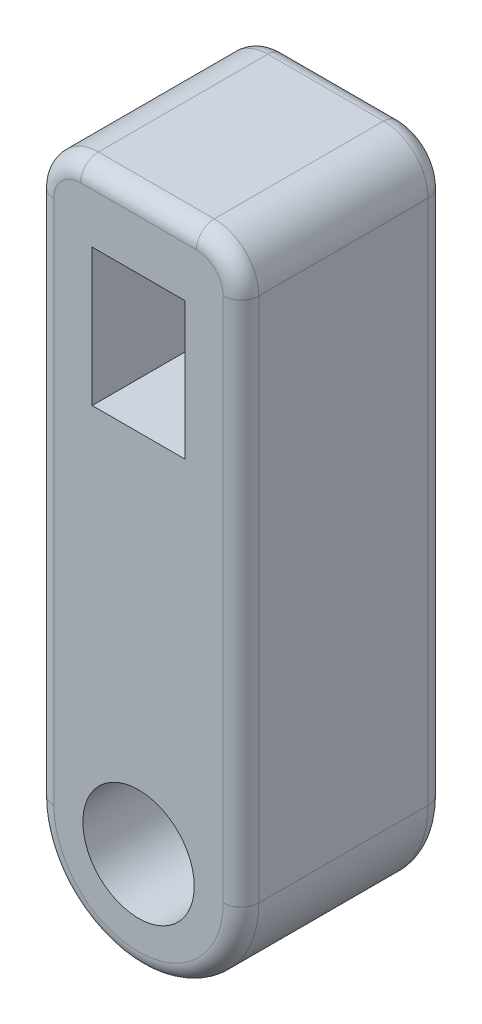
ISO-10303-21;
HEADER;
FILE_DESCRIPTION(('STEP AP214'),'2;1');
FILE_NAME('part.step','',(''),(''),'','','');
FILE_SCHEMA(('AUTOMOTIVE_DESIGN { 1 0 10303 214 1 1 1 1 }'));
ENDSEC;
DATA;
#1=APPLICATION_CONTEXT('core data for automotive mechanical design processes');
#2=APPLICATION_PROTOCOL_DEFINITION('international standard','automotive_design',2000,#1);
#3=PRODUCT_CONTEXT('',#1,'mechanical');
#4=PRODUCT('Part','Part','',(#3));
#5=PRODUCT_RELATED_PRODUCT_CATEGORY('part','',(#4));
#6=PRODUCT_DEFINITION_FORMATION('','',#4);
#7=PRODUCT_DEFINITION_CONTEXT('part definition',#1,'design');
#8=PRODUCT_DEFINITION('design','',#6,#7);
#9=PRODUCT_DEFINITION_SHAPE('','',#8);
#10=(LENGTH_UNIT() NAMED_UNIT(*) SI_UNIT(.MILLI.,.METRE.));
#11=(NAMED_UNIT(*) PLANE_ANGLE_UNIT() SI_UNIT($,.RADIAN.));
#12=(NAMED_UNIT(*) SI_UNIT($,.STERADIAN.) SOLID_ANGLE_UNIT());
#13=UNCERTAINTY_MEASURE_WITH_UNIT(LENGTH_MEASURE(1.E-05),#10,'distance_accuracy_value','');
#14=(GEOMETRIC_REPRESENTATION_CONTEXT(3) GLOBAL_UNCERTAINTY_ASSIGNED_CONTEXT((#13)) GLOBAL_UNIT_ASSIGNED_CONTEXT((#10,
#11,#12)) REPRESENTATION_CONTEXT('',''));
#15=CARTESIAN_POINT('',(0.,0.,0.));
#16=DIRECTION('',(0.,0.,1.));
#17=DIRECTION('',(1.,0.,0.));
#18=AXIS2_PLACEMENT_3D('',#15,#16,#17);
#19=CARTESIAN_POINT('',(5.2,0.,23.));
#20=DIRECTION('',(-1.,0.,0.));
#21=DIRECTION('',(0.,0.,1.));
#22=AXIS2_PLACEMENT_3D('',#19,#20,#21);
#23=PLANE('',#22);
#24=DIRECTION('',(0.,0.,-1.));
#25=VECTOR('',#24,1.);
#26=CARTESIAN_POINT('',(5.2,56.4,23.));
#27=LINE('',#26,#25);
#28=CARTESIAN_POINT('',(5.2,56.4,23.));
#29=VERTEX_POINT('',#28);
#30=CARTESIAN_POINT('',(5.2,56.4,2.74747741945462));
#31=VERTEX_POINT('',#30);
#32=EDGE_CURVE('E216',#29,#31,#27,.T.);
#33=ORIENTED_EDGE('',*,*,#32,.T.);
#34=DIRECTION('',(0.,-1.,0.));
#35=VECTOR('',#34,1.);
#36=CARTESIAN_POINT('',(5.2,41.,2.74747741945462));
#37=LINE('',#36,#35);
#38=CARTESIAN_POINT('',(5.2,41.,2.74747741945462));
#39=VERTEX_POINT('',#38);
#40=EDGE_CURVE('E178',#31,#39,#37,.T.);
#41=ORIENTED_EDGE('',*,*,#40,.T.);
#42=DIRECTION('',(0.,0.,-1.));
#43=VECTOR('',#42,1.);
#44=CARTESIAN_POINT('',(5.2,41.,23.));
#45=LINE('',#44,#43);
#46=CARTESIAN_POINT('',(5.2,41.,23.));
#47=VERTEX_POINT('',#46);
#48=EDGE_CURVE('E173',#47,#39,#45,.T.);
#49=ORIENTED_EDGE('',*,*,#48,.F.);
#50=DIRECTION('',(0.,1.,0.));
#51=VECTOR('',#50,1.);
#52=CARTESIAN_POINT('',(5.2,0.,23.));
#53=LINE('',#52,#51);
#54=EDGE_CURVE('E176',#47,#29,#53,.T.);
#55=ORIENTED_EDGE('',*,*,#54,.T.);
#56=EDGE_LOOP('',(#33,#41,#49,#55));
#57=FACE_BOUND('',#56,.T.);
#58=ADVANCED_FACE('F43',(#57),#23,.T.);
#59=CARTESIAN_POINT('',(0.,41.,23.));
#60=DIRECTION('',(0.,1.,0.));
#61=DIRECTION('',(0.,0.,1.));
#62=AXIS2_PLACEMENT_3D('',#59,#60,#61);
#63=PLANE('',#62);
#64=ORIENTED_EDGE('',*,*,#48,.T.);
#65=DIRECTION('',(-1.,0.,0.));
#66=VECTOR('',#65,1.);
#67=CARTESIAN_POINT('',(-5.2,41.,2.74747741945462));
#68=LINE('',#67,#66);
#69=CARTESIAN_POINT('',(-5.2,41.,2.74747741945462));
#70=VERTEX_POINT('',#69);
#71=EDGE_CURVE('E246',#39,#70,#68,.T.);
#72=ORIENTED_EDGE('',*,*,#71,.T.);
#73=DIRECTION('',(0.,0.,-1.));
#74=VECTOR('',#73,1.);
#75=CARTESIAN_POINT('',(-5.2,41.,23.));
#76=LINE('',#75,#74);
#77=CARTESIAN_POINT('',(-5.2,41.,23.));
#78=VERTEX_POINT('',#77);
#79=EDGE_CURVE('E183',#78,#70,#76,.T.);
#80=ORIENTED_EDGE('',*,*,#79,.F.);
#81=DIRECTION('',(1.,0.,0.));
#82=VECTOR('',#81,1.);
#83=CARTESIAN_POINT('',(0.,41.,23.));
#84=LINE('',#83,#82);
#85=EDGE_CURVE('E190',#78,#47,#84,.T.);
#86=ORIENTED_EDGE('',*,*,#85,.T.);
#87=EDGE_LOOP('',(#64,#72,#80,#86));
#88=FACE_BOUND('',#87,.T.);
#89=ADVANCED_FACE('F196',(#88),#63,.T.);
#90=CARTESIAN_POINT('',(-5.2,0.,23.));
#91=DIRECTION('',(-1.,0.,0.));
#92=DIRECTION('',(0.,0.,1.));
#93=AXIS2_PLACEMENT_3D('',#90,#91,#92);
#94=PLANE('',#93);
#95=ORIENTED_EDGE('',*,*,#79,.T.);
#96=DIRECTION('',(0.,1.,0.));
#97=VECTOR('',#96,1.);
#98=CARTESIAN_POINT('',(-5.2,0.,2.74747741945462));
#99=LINE('',#98,#97);
#100=CARTESIAN_POINT('',(-5.2,56.4,2.74747741945462));
#101=VERTEX_POINT('',#100);
#102=EDGE_CURVE('E249',#70,#101,#99,.T.);
#103=ORIENTED_EDGE('',*,*,#102,.T.);
#104=DIRECTION('',(0.,0.,-1.));
#105=VECTOR('',#104,1.);
#106=CARTESIAN_POINT('',(-5.2,56.4,23.));
#107=LINE('',#106,#105);
#108=CARTESIAN_POINT('',(-5.2,56.4,23.));
#109=VERTEX_POINT('',#108);
#110=EDGE_CURVE('E219',#109,#101,#107,.T.);
#111=ORIENTED_EDGE('',*,*,#110,.F.);
#112=DIRECTION('',(0.,1.,0.));
#113=VECTOR('',#112,1.);
#114=CARTESIAN_POINT('',(-5.2,0.,23.));
#115=LINE('',#114,#113);
#116=EDGE_CURVE('E200',#78,#109,#115,.T.);
#117=ORIENTED_EDGE('',*,*,#116,.F.);
#118=EDGE_LOOP('',(#95,#103,#111,#117));
#119=FACE_BOUND('',#118,.T.);
#120=ADVANCED_FACE('F477',(#119),#94,.F.);
#121=CARTESIAN_POINT('',(-11.5,0.,23.));
#122=DIRECTION('',(-1.,0.,0.));
#123=DIRECTION('',(0.,-1.,0.));
#124=AXIS2_PLACEMENT_3D('',#121,#122,#123);
#125=PLANE('',#124);
#126=DIRECTION('',(0.,0.,-1.));
#127=VECTOR('',#126,1.);
#128=CARTESIAN_POINT('',(-11.5,59.,23.));
#129=LINE('',#128,#127);
#130=CARTESIAN_POINT('',(-11.5,59.,21.));
#131=VERTEX_POINT('',#130);
#132=CARTESIAN_POINT('',(-11.5,59.,2.));
#133=VERTEX_POINT('',#132);
#134=EDGE_CURVE('E255',#131,#133,#129,.T.);
#135=ORIENTED_EDGE('',*,*,#134,.T.);
#136=DIRECTION('',(0.,1.,0.));
#137=VECTOR('',#136,1.);
#138=CARTESIAN_POINT('',(-11.5,0.,2.));
#139=LINE('',#138,#137);
#140=CARTESIAN_POINT('',(-11.5,0.,2.));
#141=VERTEX_POINT('',#140);
#142=EDGE_CURVE('E11',#133,#141,#139,.F.);
#143=ORIENTED_EDGE('',*,*,#142,.T.);
#144=DIRECTION('',(0.,0.,-1.));
#145=VECTOR('',#144,1.);
#146=CARTESIAN_POINT('',(-11.5,0.,23.));
#147=LINE('',#146,#145);
#148=CARTESIAN_POINT('',(-11.5,0.,21.));
#149=VERTEX_POINT('',#148);
#150=EDGE_CURVE('E220',#149,#141,#147,.T.);
#151=ORIENTED_EDGE('',*,*,#150,.F.);
#152=DIRECTION('',(0.,1.,0.));
#153=VECTOR('',#152,1.);
#154=CARTESIAN_POINT('',(-11.5,0.,21.));
#155=LINE('',#154,#153);
#156=EDGE_CURVE('E53',#149,#131,#155,.T.);
#157=ORIENTED_EDGE('',*,*,#156,.T.);
#158=EDGE_LOOP('',(#135,#143,#151,#157));
#159=FACE_BOUND('',#158,.T.);
#160=ADVANCED_FACE('F449',(#159),#125,.T.);
#161=CARTESIAN_POINT('',(0.,0.,23.));
#162=DIRECTION('',(0.,0.,-1.));
#163=DIRECTION('',(-1.,0.,0.));
#164=AXIS2_PLACEMENT_3D('',#161,#162,#163);
#165=CYLINDRICAL_SURFACE('',#164,11.5000000000001);
#166=ORIENTED_EDGE('',*,*,#150,.T.);
#167=CARTESIAN_POINT('',(0.,0.,2.));
#168=DIRECTION('',(0.,0.,1.));
#169=DIRECTION('',(1.,0.,0.));
#170=AXIS2_PLACEMENT_3D('',#167,#168,#169);
#171=CIRCLE('',#170,11.5000000000001);
#172=CARTESIAN_POINT('',(11.5,0.,2.));
#173=VERTEX_POINT('',#172);
#174=EDGE_CURVE('E289',#141,#173,#171,.T.);
#175=ORIENTED_EDGE('',*,*,#174,.T.);
#176=DIRECTION('',(0.,0.,-1.));
#177=VECTOR('',#176,1.);
#178=CARTESIAN_POINT('',(11.5,0.,23.));
#179=LINE('',#178,#177);
#180=CARTESIAN_POINT('',(11.5,0.,21.));
#181=VERTEX_POINT('',#180);
#182=EDGE_CURVE('E211',#181,#173,#179,.T.);
#183=ORIENTED_EDGE('',*,*,#182,.F.);
#184=CARTESIAN_POINT('',(0.,0.,21.));
#185=DIRECTION('',(0.,0.,1.));
#186=DIRECTION('',(1.,0.,0.));
#187=AXIS2_PLACEMENT_3D('',#184,#185,#186);
#188=CIRCLE('',#187,11.5000000000001);
#189=EDGE_CURVE('E285',#181,#149,#188,.F.);
#190=ORIENTED_EDGE('',*,*,#189,.T.);
#191=EDGE_LOOP('',(#166,#175,#183,#190));
#192=FACE_BOUND('',#191,.T.);
#193=ADVANCED_FACE('F458',(#192),#165,.T.);
#194=CARTESIAN_POINT('',(11.5,0.,23.));
#195=DIRECTION('',(-1.,0.,0.));
#196=DIRECTION('',(0.,-1.,0.));
#197=AXIS2_PLACEMENT_3D('',#194,#195,#196);
#198=PLANE('',#197);
#199=ORIENTED_EDGE('',*,*,#182,.T.);
#200=DIRECTION('',(0.,1.,0.));
#201=VECTOR('',#200,1.);
#202=CARTESIAN_POINT('',(11.5,0.,2.));
#203=LINE('',#202,#201);
#204=CARTESIAN_POINT('',(11.5,59.,2.));
#205=VERTEX_POINT('',#204);
#206=EDGE_CURVE('E315',#173,#205,#203,.T.);
#207=ORIENTED_EDGE('',*,*,#206,.T.);
#208=DIRECTION('',(0.,0.,-1.));
#209=VECTOR('',#208,1.);
#210=CARTESIAN_POINT('',(11.5,59.,23.));
#211=LINE('',#210,#209);
#212=CARTESIAN_POINT('',(11.5,59.,21.));
#213=VERTEX_POINT('',#212);
#214=EDGE_CURVE('E281',#205,#213,#211,.F.);
#215=ORIENTED_EDGE('',*,*,#214,.T.);
#216=DIRECTION('',(0.,1.,0.));
#217=VECTOR('',#216,1.);
#218=CARTESIAN_POINT('',(11.5,0.,21.));
#219=LINE('',#218,#217);
#220=EDGE_CURVE('E312',#213,#181,#219,.F.);
#221=ORIENTED_EDGE('',*,*,#220,.T.);
#222=EDGE_LOOP('',(#199,#207,#215,#221));
#223=FACE_BOUND('',#222,.T.);
#224=ADVANCED_FACE('F485',(#223),#198,.F.);
#225=CARTESIAN_POINT('',(0.,56.4,23.));
#226=DIRECTION('',(0.,1.,0.));
#227=DIRECTION('',(-1.,0.,0.));
#228=AXIS2_PLACEMENT_3D('',#225,#226,#227);
#229=PLANE('',#228);
#230=ORIENTED_EDGE('',*,*,#110,.T.);
#231=DIRECTION('',(1.,0.,0.));
#232=VECTOR('',#231,1.);
#233=CARTESIAN_POINT('',(0.,56.4,2.74747741945462));
#234=LINE('',#233,#232);
#235=EDGE_CURVE('E252',#101,#31,#234,.T.);
#236=ORIENTED_EDGE('',*,*,#235,.T.);
#237=ORIENTED_EDGE('',*,*,#32,.F.);
#238=DIRECTION('',(1.,0.,0.));
#239=VECTOR('',#238,1.);
#240=CARTESIAN_POINT('',(0.,56.4,23.));
#241=LINE('',#240,#239);
#242=EDGE_CURVE('E191',#109,#29,#241,.T.);
#243=ORIENTED_EDGE('',*,*,#242,.F.);
#244=EDGE_LOOP('',(#230,#236,#237,#243));
#245=FACE_BOUND('',#244,.T.);
#246=ADVANCED_FACE('F484',(#245),#229,.F.);
#247=CARTESIAN_POINT('',(0.,64.,23.));
#248=DIRECTION('',(0.,1.,0.));
#249=DIRECTION('',(0.,0.,1.));
#250=AXIS2_PLACEMENT_3D('',#247,#248,#249);
#251=PLANE('',#250);
#252=DIRECTION('',(0.,0.,-1.));
#253=VECTOR('',#252,1.);
#254=CARTESIAN_POINT('',(6.5,64.,0.));
#255=LINE('',#254,#253);
#256=CARTESIAN_POINT('',(6.5,64.,21.));
#257=VERTEX_POINT('',#256);
#258=CARTESIAN_POINT('',(6.5,64.,2.));
#259=VERTEX_POINT('',#258);
#260=EDGE_CURVE('E273',#257,#259,#255,.T.);
#261=ORIENTED_EDGE('',*,*,#260,.T.);
#262=DIRECTION('',(1.,0.,0.));
#263=VECTOR('',#262,1.);
#264=CARTESIAN_POINT('',(-6.5,64.,2.));
#265=LINE('',#264,#263);
#266=CARTESIAN_POINT('',(-6.5,64.,2.));
#267=VERTEX_POINT('',#266);
#268=EDGE_CURVE('E327',#259,#267,#265,.F.);
#269=ORIENTED_EDGE('',*,*,#268,.T.);
#270=DIRECTION('',(0.,0.,-1.));
#271=VECTOR('',#270,1.);
#272=CARTESIAN_POINT('',(-6.5,64.,23.));
#273=LINE('',#272,#271);
#274=CARTESIAN_POINT('',(-6.5,64.,21.));
#275=VERTEX_POINT('',#274);
#276=EDGE_CURVE('E277',#267,#275,#273,.F.);
#277=ORIENTED_EDGE('',*,*,#276,.T.);
#278=DIRECTION('',(1.,0.,0.));
#279=VECTOR('',#278,1.);
#280=CARTESIAN_POINT('',(0.,64.,21.));
#281=LINE('',#280,#279);
#282=EDGE_CURVE('E324',#275,#257,#281,.T.);
#283=ORIENTED_EDGE('',*,*,#282,.T.);
#284=EDGE_LOOP('',(#261,#269,#277,#283));
#285=FACE_BOUND('',#284,.T.);
#286=ADVANCED_FACE('F407',(#285),#251,.T.);
#287=CARTESIAN_POINT('',(0.,0.,23.));
#288=DIRECTION('',(0.,0.,-1.));
#289=DIRECTION('',(-1.,0.,0.));
#290=AXIS2_PLACEMENT_3D('',#287,#288,#289);
#291=CYLINDRICAL_SURFACE('',#290,6.25);
#292=CARTESIAN_POINT('',(0.,0.,23.));
#293=DIRECTION('',(0.,0.,1.));
#294=DIRECTION('',(1.,0.,0.));
#295=AXIS2_PLACEMENT_3D('',#292,#293,#294);
#296=CIRCLE('',#295,6.25);
#297=CARTESIAN_POINT('',(6.25,0.,23.));
#298=VERTEX_POINT('',#297);
#299=EDGE_CURVE('E207',#298,#298,#296,.T.);
#300=ORIENTED_EDGE('',*,*,#299,.T.);
#301=EDGE_LOOP('',(#300));
#302=FACE_BOUND('',#301,.T.);
#303=CARTESIAN_POINT('',(0.,0.,0.));
#304=DIRECTION('',(0.,0.,1.));
#305=DIRECTION('',(1.,0.,0.));
#306=AXIS2_PLACEMENT_3D('',#303,#304,#305);
#307=CIRCLE('',#306,6.25);
#308=CARTESIAN_POINT('',(6.25,0.,0.));
#309=VERTEX_POINT('',#308);
#310=EDGE_CURVE('E194',#309,#309,#307,.T.);
#311=ORIENTED_EDGE('',*,*,#310,.F.);
#312=EDGE_LOOP('',(#311));
#313=FACE_BOUND('',#312,.T.);
#314=ADVANCED_FACE('F483',(#302,#313),#291,.F.);
#315=CARTESIAN_POINT('',(0.,0.,23.));
#316=DIRECTION('',(0.,0.,1.));
#317=DIRECTION('',(1.,0.,0.));
#318=AXIS2_PLACEMENT_3D('',#315,#316,#317);
#319=PLANE('',#318);
#320=DIRECTION('',(0.,1.,0.));
#321=VECTOR('',#320,1.);
#322=CARTESIAN_POINT('',(-9.5,0.,23.));
#323=LINE('',#322,#321);
#324=CARTESIAN_POINT('',(-9.5,59.,23.));
#325=VERTEX_POINT('',#324);
#326=CARTESIAN_POINT('',(-9.5,0.,23.));
#327=VERTEX_POINT('',#326);
#328=EDGE_CURVE('E336',#325,#327,#323,.F.);
#329=ORIENTED_EDGE('',*,*,#328,.T.);
#330=CARTESIAN_POINT('',(0.,0.,23.));
#331=DIRECTION('',(0.,0.,1.));
#332=DIRECTION('',(1.,0.,0.));
#333=AXIS2_PLACEMENT_3D('',#330,#331,#332);
#334=CIRCLE('',#333,9.5000000000001);
#335=CARTESIAN_POINT('',(9.5,0.,23.));
#336=VERTEX_POINT('',#335);
#337=EDGE_CURVE('E350',#327,#336,#334,.T.);
#338=ORIENTED_EDGE('',*,*,#337,.T.);
#339=DIRECTION('',(0.,1.,0.));
#340=VECTOR('',#339,1.);
#341=CARTESIAN_POINT('',(9.5,59.,23.));
#342=LINE('',#341,#340);
#343=CARTESIAN_POINT('',(9.5,59.,23.));
#344=VERTEX_POINT('',#343);
#345=EDGE_CURVE('E68',#336,#344,#342,.T.);
#346=ORIENTED_EDGE('',*,*,#345,.T.);
#347=CARTESIAN_POINT('',(6.5,59.,23.));
#348=DIRECTION('',(0.,0.,1.));
#349=DIRECTION('',(1.,0.,0.));
#350=AXIS2_PLACEMENT_3D('',#347,#348,#349);
#351=CIRCLE('',#350,3.);
#352=CARTESIAN_POINT('',(6.5,62.,23.));
#353=VERTEX_POINT('',#352);
#354=EDGE_CURVE('E345',#344,#353,#351,.T.);
#355=ORIENTED_EDGE('',*,*,#354,.T.);
#356=DIRECTION('',(1.,0.,0.));
#357=VECTOR('',#356,1.);
#358=CARTESIAN_POINT('',(0.,62.,23.));
#359=LINE('',#358,#357);
#360=CARTESIAN_POINT('',(-6.5,62.,23.));
#361=VERTEX_POINT('',#360);
#362=EDGE_CURVE('E342',#353,#361,#359,.F.);
#363=ORIENTED_EDGE('',*,*,#362,.T.);
#364=CARTESIAN_POINT('',(-6.5,59.,23.));
#365=DIRECTION('',(0.,0.,1.));
#366=DIRECTION('',(1.,0.,0.));
#367=AXIS2_PLACEMENT_3D('',#364,#365,#366);
#368=CIRCLE('',#367,3.);
#369=EDGE_CURVE('E339',#361,#325,#368,.T.);
#370=ORIENTED_EDGE('',*,*,#369,.T.);
#371=EDGE_LOOP('',(#329,#338,#346,#355,#363,#370));
#372=FACE_BOUND('',#371,.T.);
#373=ORIENTED_EDGE('',*,*,#54,.F.);
#374=ORIENTED_EDGE('',*,*,#85,.F.);
#375=ORIENTED_EDGE('',*,*,#116,.T.);
#376=ORIENTED_EDGE('',*,*,#242,.T.);
#377=EDGE_LOOP('',(#373,#374,#375,#376));
#378=FACE_BOUND('',#377,.T.);
#379=ORIENTED_EDGE('',*,*,#299,.F.);
#380=EDGE_LOOP('',(#379));
#381=FACE_BOUND('',#380,.T.);
#382=ADVANCED_FACE('F187',(#372,#378,#381),#319,.T.);
#383=CARTESIAN_POINT('',(0.,0.,0.));
#384=DIRECTION('',(0.,0.,1.));
#385=DIRECTION('',(1.,0.,0.));
#386=AXIS2_PLACEMENT_3D('',#383,#384,#385);
#387=PLANE('',#386);
#388=DIRECTION('',(0.,1.,0.));
#389=VECTOR('',#388,1.);
#390=CARTESIAN_POINT('',(9.5,0.,0.));
#391=LINE('',#390,#389);
#392=CARTESIAN_POINT('',(9.5,59.,0.));
#393=VERTEX_POINT('',#392);
#394=CARTESIAN_POINT('',(9.5,0.,0.));
#395=VERTEX_POINT('',#394);
#396=EDGE_CURVE('E305',#393,#395,#391,.F.);
#397=ORIENTED_EDGE('',*,*,#396,.T.);
#398=CARTESIAN_POINT('',(0.,0.,0.));
#399=DIRECTION('',(0.,0.,1.));
#400=DIRECTION('',(1.,0.,0.));
#401=AXIS2_PLACEMENT_3D('',#398,#399,#400);
#402=CIRCLE('',#401,9.5000000000001);
#403=CARTESIAN_POINT('',(-9.5,0.,0.));
#404=VERTEX_POINT('',#403);
#405=EDGE_CURVE('E308',#395,#404,#402,.F.);
#406=ORIENTED_EDGE('',*,*,#405,.T.);
#407=DIRECTION('',(0.,1.,0.));
#408=VECTOR('',#407,1.);
#409=CARTESIAN_POINT('',(-9.5,59.,0.));
#410=LINE('',#409,#408);
#411=CARTESIAN_POINT('',(-9.5,59.,0.));
#412=VERTEX_POINT('',#411);
#413=EDGE_CURVE('E293',#404,#412,#410,.T.);
#414=ORIENTED_EDGE('',*,*,#413,.T.);
#415=CARTESIAN_POINT('',(-6.5,59.,0.));
#416=DIRECTION('',(0.,0.,1.));
#417=DIRECTION('',(1.,0.,0.));
#418=AXIS2_PLACEMENT_3D('',#415,#416,#417);
#419=CIRCLE('',#418,3.);
#420=CARTESIAN_POINT('',(-6.5,62.,0.));
#421=VERTEX_POINT('',#420);
#422=EDGE_CURVE('E296',#412,#421,#419,.F.);
#423=ORIENTED_EDGE('',*,*,#422,.T.);
#424=DIRECTION('',(1.,0.,0.));
#425=VECTOR('',#424,1.);
#426=CARTESIAN_POINT('',(6.5,62.,0.));
#427=LINE('',#426,#425);
#428=CARTESIAN_POINT('',(6.5,62.,0.));
#429=VERTEX_POINT('',#428);
#430=EDGE_CURVE('E299',#421,#429,#427,.T.);
#431=ORIENTED_EDGE('',*,*,#430,.T.);
#432=CARTESIAN_POINT('',(6.5,59.,0.));
#433=DIRECTION('',(0.,0.,1.));
#434=DIRECTION('',(1.,0.,0.));
#435=AXIS2_PLACEMENT_3D('',#432,#433,#434);
#436=CIRCLE('',#435,3.);
#437=EDGE_CURVE('E302',#429,#393,#436,.F.);
#438=ORIENTED_EDGE('',*,*,#437,.T.);
#439=EDGE_LOOP('',(#397,#406,#414,#423,#431,#438));
#440=FACE_BOUND('',#439,.T.);
#441=DIRECTION('',(1.,0.,0.));
#442=VECTOR('',#441,1.);
#443=CARTESIAN_POINT('',(5.2,40.,0.));
#444=LINE('',#443,#442);
#445=CARTESIAN_POINT('',(-6.2,40.,0.));
#446=VERTEX_POINT('',#445);
#447=CARTESIAN_POINT('',(6.2,40.,0.));
#448=VERTEX_POINT('',#447);
#449=EDGE_CURVE('E237',#446,#448,#444,.T.);
#450=ORIENTED_EDGE('',*,*,#449,.T.);
#451=DIRECTION('',(0.,1.,0.));
#452=VECTOR('',#451,1.);
#453=CARTESIAN_POINT('',(6.2,56.4,0.));
#454=LINE('',#453,#452);
#455=CARTESIAN_POINT('',(6.2,57.4,0.));
#456=VERTEX_POINT('',#455);
#457=EDGE_CURVE('E240',#448,#456,#454,.T.);
#458=ORIENTED_EDGE('',*,*,#457,.T.);
#459=DIRECTION('',(-1.,0.,0.));
#460=VECTOR('',#459,1.);
#461=CARTESIAN_POINT('',(0.,57.4,0.));
#462=LINE('',#461,#460);
#463=CARTESIAN_POINT('',(-6.2,57.4,0.));
#464=VERTEX_POINT('',#463);
#465=EDGE_CURVE('E182',#456,#464,#462,.T.);
#466=ORIENTED_EDGE('',*,*,#465,.T.);
#467=DIRECTION('',(0.,-1.,0.));
#468=VECTOR('',#467,1.);
#469=CARTESIAN_POINT('',(-6.2,0.,0.));
#470=LINE('',#469,#468);
#471=EDGE_CURVE('E234',#464,#446,#470,.T.);
#472=ORIENTED_EDGE('',*,*,#471,.T.);
#473=EDGE_LOOP('',(#450,#458,#466,#472));
#474=FACE_BOUND('',#473,.T.);
#475=ORIENTED_EDGE('',*,*,#310,.T.);
#476=EDGE_LOOP('',(#475));
#477=FACE_BOUND('',#476,.T.);
#478=ADVANCED_FACE('F426',(#440,#474,#477),#387,.F.);
#479=CARTESIAN_POINT('',(-5.2,0.,2.74747741945462));
#480=DIRECTION('',(-0.939692620785908,0.,0.342020143325669));
#481=DIRECTION('',(0.,1.,0.));
#482=AXIS2_PLACEMENT_3D('',#479,#480,#481);
#483=PLANE('',#482);
#484=DIRECTION('',(-0.323615577118185,0.323615577118185,-0.889126490715988));
#485=VECTOR('',#484,1.);
#486=CARTESIAN_POINT('',(0.70660515489943,50.4933948451006,18.9757417081751));
#487=LINE('',#486,#485);
#488=EDGE_CURVE('E263',#101,#464,#487,.T.);
#489=ORIENTED_EDGE('',*,*,#488,.F.);
#490=ORIENTED_EDGE('',*,*,#102,.F.);
#491=DIRECTION('',(0.323615577118185,0.323615577118185,0.889126490715988));
#492=VECTOR('',#491,1.);
#493=CARTESIAN_POINT('',(-5.55069234112808,40.6493076588719,1.78395813102955));
#494=LINE('',#493,#492);
#495=EDGE_CURVE('E215',#446,#70,#494,.T.);
#496=ORIENTED_EDGE('',*,*,#495,.F.);
#497=ORIENTED_EDGE('',*,*,#471,.F.);
#498=EDGE_LOOP('',(#489,#490,#496,#497));
#499=FACE_BOUND('',#498,.T.);
#500=ADVANCED_FACE('F514',(#499),#483,.F.);
#501=CARTESIAN_POINT('',(0.,40.,0.));
#502=DIRECTION('',(0.,0.939692620785908,-0.342020143325669));
#503=DIRECTION('',(-1.,0.,0.));
#504=AXIS2_PLACEMENT_3D('',#501,#502,#503);
#505=PLANE('',#504);
#506=ORIENTED_EDGE('',*,*,#495,.T.);
#507=ORIENTED_EDGE('',*,*,#71,.F.);
#508=DIRECTION('',(0.323615577118185,-0.323615577118185,-0.889126490715988));
#509=VECTOR('',#508,1.);
#510=CARTESIAN_POINT('',(10.3890816701414,35.8109183298586,-11.5094072969648));
#511=LINE('',#510,#509);
#512=EDGE_CURVE('E259',#448,#39,#511,.F.);
#513=ORIENTED_EDGE('',*,*,#512,.F.);
#514=ORIENTED_EDGE('',*,*,#449,.F.);
#515=EDGE_LOOP('',(#506,#507,#513,#514));
#516=FACE_BOUND('',#515,.T.);
#517=ADVANCED_FACE('F507',(#516),#505,.T.);
#518=CARTESIAN_POINT('',(0.,56.4,2.74747741945462));
#519=DIRECTION('',(0.,0.939692620785908,0.342020143325669));
#520=DIRECTION('',(1.,0.,0.));
#521=AXIS2_PLACEMENT_3D('',#518,#519,#520);
#522=PLANE('',#521);
#523=ORIENTED_EDGE('',*,*,#488,.T.);
#524=ORIENTED_EDGE('',*,*,#465,.F.);
#525=DIRECTION('',(0.323615577118185,0.323615577118185,-0.889126490715988));
#526=VECTOR('',#525,1.);
#527=CARTESIAN_POINT('',(0.188667803347045,51.388667803347,16.5159994711445));
#528=LINE('',#527,#526);
#529=EDGE_CURVE('E256',#31,#456,#528,.T.);
#530=ORIENTED_EDGE('',*,*,#529,.F.);
#531=ORIENTED_EDGE('',*,*,#235,.F.);
#532=EDGE_LOOP('',(#523,#524,#530,#531));
#533=FACE_BOUND('',#532,.T.);
#534=ADVANCED_FACE('F500',(#533),#522,.F.);
#535=CARTESIAN_POINT('',(6.2,0.,0.));
#536=DIRECTION('',(-0.939692620785908,0.,-0.342020143325669));
#537=DIRECTION('',(0.,-1.,0.));
#538=AXIS2_PLACEMENT_3D('',#535,#536,#537);
#539=PLANE('',#538);
#540=ORIENTED_EDGE('',*,*,#512,.T.);
#541=ORIENTED_EDGE('',*,*,#40,.F.);
#542=ORIENTED_EDGE('',*,*,#529,.T.);
#543=ORIENTED_EDGE('',*,*,#457,.F.);
#544=EDGE_LOOP('',(#540,#541,#542,#543));
#545=FACE_BOUND('',#544,.T.);
#546=ADVANCED_FACE('F494',(#545),#539,.T.);
#547=CARTESIAN_POINT('',(-6.5,59.,23.));
#548=DIRECTION('',(0.,0.,-1.));
#549=DIRECTION('',(-1.,0.,0.));
#550=AXIS2_PLACEMENT_3D('',#547,#548,#549);
#551=CYLINDRICAL_SURFACE('',#550,5.);
#552=ORIENTED_EDGE('',*,*,#276,.F.);
#553=CARTESIAN_POINT('',(-6.5,59.,2.));
#554=DIRECTION('',(0.,0.,1.));
#555=DIRECTION('',(1.,0.,0.));
#556=AXIS2_PLACEMENT_3D('',#553,#554,#555);
#557=CIRCLE('',#556,5.);
#558=EDGE_CURVE('E333',#267,#133,#557,.T.);
#559=ORIENTED_EDGE('',*,*,#558,.T.);
#560=ORIENTED_EDGE('',*,*,#134,.F.);
#561=CARTESIAN_POINT('',(-6.5,59.,21.));
#562=DIRECTION('',(0.,0.,1.));
#563=DIRECTION('',(1.,0.,0.));
#564=AXIS2_PLACEMENT_3D('',#561,#562,#563);
#565=CIRCLE('',#564,5.);
#566=EDGE_CURVE('E330',#131,#275,#565,.F.);
#567=ORIENTED_EDGE('',*,*,#566,.T.);
#568=EDGE_LOOP('',(#552,#559,#560,#567));
#569=FACE_BOUND('',#568,.T.);
#570=ADVANCED_FACE('F446',(#569),#551,.T.);
#571=CARTESIAN_POINT('',(6.5,59.,23.));
#572=DIRECTION('',(0.,0.,1.));
#573=DIRECTION('',(1.,0.,0.));
#574=AXIS2_PLACEMENT_3D('',#571,#572,#573);
#575=CYLINDRICAL_SURFACE('',#574,5.);
#576=ORIENTED_EDGE('',*,*,#214,.F.);
#577=CARTESIAN_POINT('',(6.5,59.,2.));
#578=DIRECTION('',(0.,0.,1.));
#579=DIRECTION('',(1.,0.,0.));
#580=AXIS2_PLACEMENT_3D('',#577,#578,#579);
#581=CIRCLE('',#580,5.);
#582=EDGE_CURVE('E321',#205,#259,#581,.T.);
#583=ORIENTED_EDGE('',*,*,#582,.T.);
#584=ORIENTED_EDGE('',*,*,#260,.F.);
#585=CARTESIAN_POINT('',(6.5,59.,21.));
#586=DIRECTION('',(0.,0.,1.));
#587=DIRECTION('',(1.,0.,0.));
#588=AXIS2_PLACEMENT_3D('',#585,#586,#587);
#589=CIRCLE('',#588,5.);
#590=EDGE_CURVE('E318',#257,#213,#589,.F.);
#591=ORIENTED_EDGE('',*,*,#590,.T.);
#592=EDGE_LOOP('',(#576,#583,#584,#591));
#593=FACE_BOUND('',#592,.T.);
#594=ADVANCED_FACE('F412',(#593),#575,.T.);
#595=CARTESIAN_POINT('',(0.,62.,2.));
#596=DIRECTION('',(-1.,0.,0.));
#597=DIRECTION('',(0.,0.,1.));
#598=AXIS2_PLACEMENT_3D('',#595,#596,#597);
#599=CYLINDRICAL_SURFACE('',#598,2.);
#600=CARTESIAN_POINT('',(6.5,62.,2.));
#601=DIRECTION('',(1.,0.,0.));
#602=DIRECTION('',(0.,0.,-1.));
#603=AXIS2_PLACEMENT_3D('',#600,#601,#602);
#604=CIRCLE('',#603,2.);
#605=EDGE_CURVE('E369',#429,#259,#604,.T.);
#606=ORIENTED_EDGE('',*,*,#605,.F.);
#607=ORIENTED_EDGE('',*,*,#430,.F.);
#608=CARTESIAN_POINT('',(-6.5,62.,2.));
#609=DIRECTION('',(-1.,0.,0.));
#610=DIRECTION('',(0.,0.,1.));
#611=AXIS2_PLACEMENT_3D('',#608,#609,#610);
#612=CIRCLE('',#611,2.);
#613=EDGE_CURVE('E260',#267,#421,#612,.T.);
#614=ORIENTED_EDGE('',*,*,#613,.F.);
#615=ORIENTED_EDGE('',*,*,#268,.F.);
#616=EDGE_LOOP('',(#606,#607,#614,#615));
#617=FACE_BOUND('',#616,.T.);
#618=ADVANCED_FACE('F444',(#617),#599,.T.);
#619=CARTESIAN_POINT('',(-6.5,59.,2.));
#620=DIRECTION('',(0.,0.,1.));
#621=DIRECTION('',(1.,0.,0.));
#622=AXIS2_PLACEMENT_3D('',#619,#620,#621);
#623=TOROIDAL_SURFACE('',#622,3.,2.);
#624=ORIENTED_EDGE('',*,*,#613,.T.);
#625=ORIENTED_EDGE('',*,*,#422,.F.);
#626=CARTESIAN_POINT('',(-9.5,59.,2.));
#627=DIRECTION('',(0.,-1.,0.));
#628=DIRECTION('',(0.,0.,-1.));
#629=AXIS2_PLACEMENT_3D('',#626,#627,#628);
#630=CIRCLE('',#629,2.);
#631=EDGE_CURVE('E365',#133,#412,#630,.T.);
#632=ORIENTED_EDGE('',*,*,#631,.F.);
#633=ORIENTED_EDGE('',*,*,#558,.F.);
#634=EDGE_LOOP('',(#624,#625,#632,#633));
#635=FACE_BOUND('',#634,.T.);
#636=ADVANCED_FACE('F440',(#635),#623,.T.);
#637=CARTESIAN_POINT('',(6.5,59.,2.));
#638=DIRECTION('',(0.,0.,1.));
#639=DIRECTION('',(1.,0.,0.));
#640=AXIS2_PLACEMENT_3D('',#637,#638,#639);
#641=TOROIDAL_SURFACE('',#640,3.,2.);
#642=ORIENTED_EDGE('',*,*,#605,.T.);
#643=ORIENTED_EDGE('',*,*,#582,.F.);
#644=CARTESIAN_POINT('',(9.5,59.,2.));
#645=DIRECTION('',(0.,-1.,0.));
#646=DIRECTION('',(0.,0.,-1.));
#647=AXIS2_PLACEMENT_3D('',#644,#645,#646);
#648=CIRCLE('',#647,2.);
#649=EDGE_CURVE('E361',#393,#205,#648,.T.);
#650=ORIENTED_EDGE('',*,*,#649,.F.);
#651=ORIENTED_EDGE('',*,*,#437,.F.);
#652=EDGE_LOOP('',(#642,#643,#650,#651));
#653=FACE_BOUND('',#652,.T.);
#654=ADVANCED_FACE('F416',(#653),#641,.T.);
#655=CARTESIAN_POINT('',(-9.5,0.,2.));
#656=DIRECTION('',(0.,-1.,0.));
#657=DIRECTION('',(1.,0.,0.));
#658=AXIS2_PLACEMENT_3D('',#655,#656,#657);
#659=CYLINDRICAL_SURFACE('',#658,2.);
#660=ORIENTED_EDGE('',*,*,#631,.T.);
#661=ORIENTED_EDGE('',*,*,#413,.F.);
#662=CARTESIAN_POINT('',(-9.5,0.,2.));
#663=DIRECTION('',(0.,-1.,0.));
#664=DIRECTION('',(1.,0.,0.));
#665=AXIS2_PLACEMENT_3D('',#662,#663,#664);
#666=CIRCLE('',#665,2.);
#667=EDGE_CURVE('E358',#141,#404,#666,.T.);
#668=ORIENTED_EDGE('',*,*,#667,.F.);
#669=ORIENTED_EDGE('',*,*,#142,.F.);
#670=EDGE_LOOP('',(#660,#661,#668,#669));
#671=FACE_BOUND('',#670,.T.);
#672=ADVANCED_FACE('F435',(#671),#659,.T.);
#673=CARTESIAN_POINT('',(9.5,0.,2.));
#674=DIRECTION('',(0.,1.,0.));
#675=DIRECTION('',(-1.,0.,0.));
#676=AXIS2_PLACEMENT_3D('',#673,#674,#675);
#677=CYLINDRICAL_SURFACE('',#676,2.);
#678=ORIENTED_EDGE('',*,*,#649,.T.);
#679=ORIENTED_EDGE('',*,*,#206,.F.);
#680=CARTESIAN_POINT('',(9.5,0.,2.));
#681=DIRECTION('',(0.,-1.,0.));
#682=DIRECTION('',(1.,0.,0.));
#683=AXIS2_PLACEMENT_3D('',#680,#681,#682);
#684=CIRCLE('',#683,2.);
#685=EDGE_CURVE('E355',#395,#173,#684,.T.);
#686=ORIENTED_EDGE('',*,*,#685,.F.);
#687=ORIENTED_EDGE('',*,*,#396,.F.);
#688=EDGE_LOOP('',(#678,#679,#686,#687));
#689=FACE_BOUND('',#688,.T.);
#690=ADVANCED_FACE('F422',(#689),#677,.T.);
#691=CARTESIAN_POINT('',(0.,0.,2.));
#692=DIRECTION('',(0.,0.,1.));
#693=DIRECTION('',(1.,0.,0.));
#694=AXIS2_PLACEMENT_3D('',#691,#692,#693);
#695=TOROIDAL_SURFACE('',#694,9.5000000000001,2.);
#696=ORIENTED_EDGE('',*,*,#667,.T.);
#697=ORIENTED_EDGE('',*,*,#405,.F.);
#698=ORIENTED_EDGE('',*,*,#685,.T.);
#699=ORIENTED_EDGE('',*,*,#174,.F.);
#700=EDGE_LOOP('',(#696,#697,#698,#699));
#701=FACE_BOUND('',#700,.T.);
#702=ADVANCED_FACE('F429',(#701),#695,.T.);
#703=CARTESIAN_POINT('',(0.,62.,21.));
#704=DIRECTION('',(1.,0.,0.));
#705=DIRECTION('',(0.,0.,-1.));
#706=AXIS2_PLACEMENT_3D('',#703,#704,#705);
#707=CYLINDRICAL_SURFACE('',#706,2.);
#708=CARTESIAN_POINT('',(6.5,62.,21.));
#709=DIRECTION('',(1.,0.,0.));
#710=DIRECTION('',(0.,0.,-1.));
#711=AXIS2_PLACEMENT_3D('',#708,#709,#710);
#712=CIRCLE('',#711,2.);
#713=EDGE_CURVE('E388',#257,#353,#712,.T.);
#714=ORIENTED_EDGE('',*,*,#713,.F.);
#715=ORIENTED_EDGE('',*,*,#282,.F.);
#716=CARTESIAN_POINT('',(-6.5,62.,21.));
#717=DIRECTION('',(-1.,0.,0.));
#718=DIRECTION('',(0.,0.,1.));
#719=AXIS2_PLACEMENT_3D('',#716,#717,#718);
#720=CIRCLE('',#719,2.);
#721=EDGE_CURVE('E47',#361,#275,#720,.T.);
#722=ORIENTED_EDGE('',*,*,#721,.F.);
#723=ORIENTED_EDGE('',*,*,#362,.F.);
#724=EDGE_LOOP('',(#714,#715,#722,#723));
#725=FACE_BOUND('',#724,.T.);
#726=ADVANCED_FACE('F45',(#725),#707,.T.);
#727=CARTESIAN_POINT('',(-6.5,59.,21.));
#728=DIRECTION('',(0.,0.,1.));
#729=DIRECTION('',(1.,0.,0.));
#730=AXIS2_PLACEMENT_3D('',#727,#728,#729);
#731=TOROIDAL_SURFACE('',#730,3.,2.);
#732=ORIENTED_EDGE('',*,*,#721,.T.);
#733=ORIENTED_EDGE('',*,*,#566,.F.);
#734=CARTESIAN_POINT('',(-9.5,59.,21.));
#735=DIRECTION('',(0.,-1.,0.));
#736=DIRECTION('',(0.,0.,-1.));
#737=AXIS2_PLACEMENT_3D('',#734,#735,#736);
#738=CIRCLE('',#737,2.);
#739=EDGE_CURVE('E385',#325,#131,#738,.T.);
#740=ORIENTED_EDGE('',*,*,#739,.F.);
#741=ORIENTED_EDGE('',*,*,#369,.F.);
#742=EDGE_LOOP('',(#732,#733,#740,#741));
#743=FACE_BOUND('',#742,.T.);
#744=ADVANCED_FACE('F400',(#743),#731,.T.);
#745=CARTESIAN_POINT('',(6.5,59.,21.));
#746=DIRECTION('',(0.,0.,1.));
#747=DIRECTION('',(1.,0.,0.));
#748=AXIS2_PLACEMENT_3D('',#745,#746,#747);
#749=TOROIDAL_SURFACE('',#748,3.,2.);
#750=ORIENTED_EDGE('',*,*,#713,.T.);
#751=ORIENTED_EDGE('',*,*,#354,.F.);
#752=CARTESIAN_POINT('',(9.5,59.,21.));
#753=DIRECTION('',(0.,-1.,0.));
#754=DIRECTION('',(0.,0.,-1.));
#755=AXIS2_PLACEMENT_3D('',#752,#753,#754);
#756=CIRCLE('',#755,2.);
#757=EDGE_CURVE('E381',#213,#344,#756,.T.);
#758=ORIENTED_EDGE('',*,*,#757,.F.);
#759=ORIENTED_EDGE('',*,*,#590,.F.);
#760=EDGE_LOOP('',(#750,#751,#758,#759));
#761=FACE_BOUND('',#760,.T.);
#762=ADVANCED_FACE('F464',(#761),#749,.T.);
#763=CARTESIAN_POINT('',(-9.5,0.,21.));
#764=DIRECTION('',(0.,1.,0.));
#765=DIRECTION('',(-1.,0.,0.));
#766=AXIS2_PLACEMENT_3D('',#763,#764,#765);
#767=CYLINDRICAL_SURFACE('',#766,2.);
#768=ORIENTED_EDGE('',*,*,#739,.T.);
#769=ORIENTED_EDGE('',*,*,#156,.F.);
#770=CARTESIAN_POINT('',(-9.5,0.,21.));
#771=DIRECTION('',(0.,-1.,0.));
#772=DIRECTION('',(1.,0.,0.));
#773=AXIS2_PLACEMENT_3D('',#770,#771,#772);
#774=CIRCLE('',#773,2.);
#775=EDGE_CURVE('E378',#327,#149,#774,.T.);
#776=ORIENTED_EDGE('',*,*,#775,.F.);
#777=ORIENTED_EDGE('',*,*,#328,.F.);
#778=EDGE_LOOP('',(#768,#769,#776,#777));
#779=FACE_BOUND('',#778,.T.);
#780=ADVANCED_FACE('F454',(#779),#767,.T.);
#781=CARTESIAN_POINT('',(9.5,0.,21.));
#782=DIRECTION('',(0.,-1.,0.));
#783=DIRECTION('',(1.,0.,0.));
#784=AXIS2_PLACEMENT_3D('',#781,#782,#783);
#785=CYLINDRICAL_SURFACE('',#784,2.);
#786=ORIENTED_EDGE('',*,*,#757,.T.);
#787=ORIENTED_EDGE('',*,*,#345,.F.);
#788=CARTESIAN_POINT('',(9.5,0.,21.));
#789=DIRECTION('',(0.,-1.,0.));
#790=DIRECTION('',(1.,0.,0.));
#791=AXIS2_PLACEMENT_3D('',#788,#789,#790);
#792=CIRCLE('',#791,2.);
#793=EDGE_CURVE('E61',#181,#336,#792,.T.);
#794=ORIENTED_EDGE('',*,*,#793,.F.);
#795=ORIENTED_EDGE('',*,*,#220,.F.);
#796=EDGE_LOOP('',(#786,#787,#794,#795));
#797=FACE_BOUND('',#796,.T.);
#798=ADVANCED_FACE('F462',(#797),#785,.T.);
#799=CARTESIAN_POINT('',(0.,0.,21.));
#800=DIRECTION('',(0.,0.,1.));
#801=DIRECTION('',(1.,0.,0.));
#802=AXIS2_PLACEMENT_3D('',#799,#800,#801);
#803=TOROIDAL_SURFACE('',#802,9.5000000000001,2.);
#804=ORIENTED_EDGE('',*,*,#775,.T.);
#805=ORIENTED_EDGE('',*,*,#189,.F.);
#806=ORIENTED_EDGE('',*,*,#793,.T.);
#807=ORIENTED_EDGE('',*,*,#337,.F.);
#808=EDGE_LOOP('',(#804,#805,#806,#807));
#809=FACE_BOUND('',#808,.T.);
#810=ADVANCED_FACE('F459',(#809),#803,.T.);
#811=CLOSED_SHELL('',(#58,#89,#120,#160,#193,#224,#246,#286,#314,#382,#478,#500,#517,#534,#546,
#570,#594,#618,#636,#654,#672,#690,#702,#726,#744,#762,#780,#798,#810));
#812=MANIFOLD_SOLID_BREP('B2',#811);
#813=ADVANCED_BREP_SHAPE_REPRESENTATION('',(#18,#812),#14);
#814=SHAPE_DEFINITION_REPRESENTATION(#9,#813);
ENDSEC;
END-ISO-10303-21;
